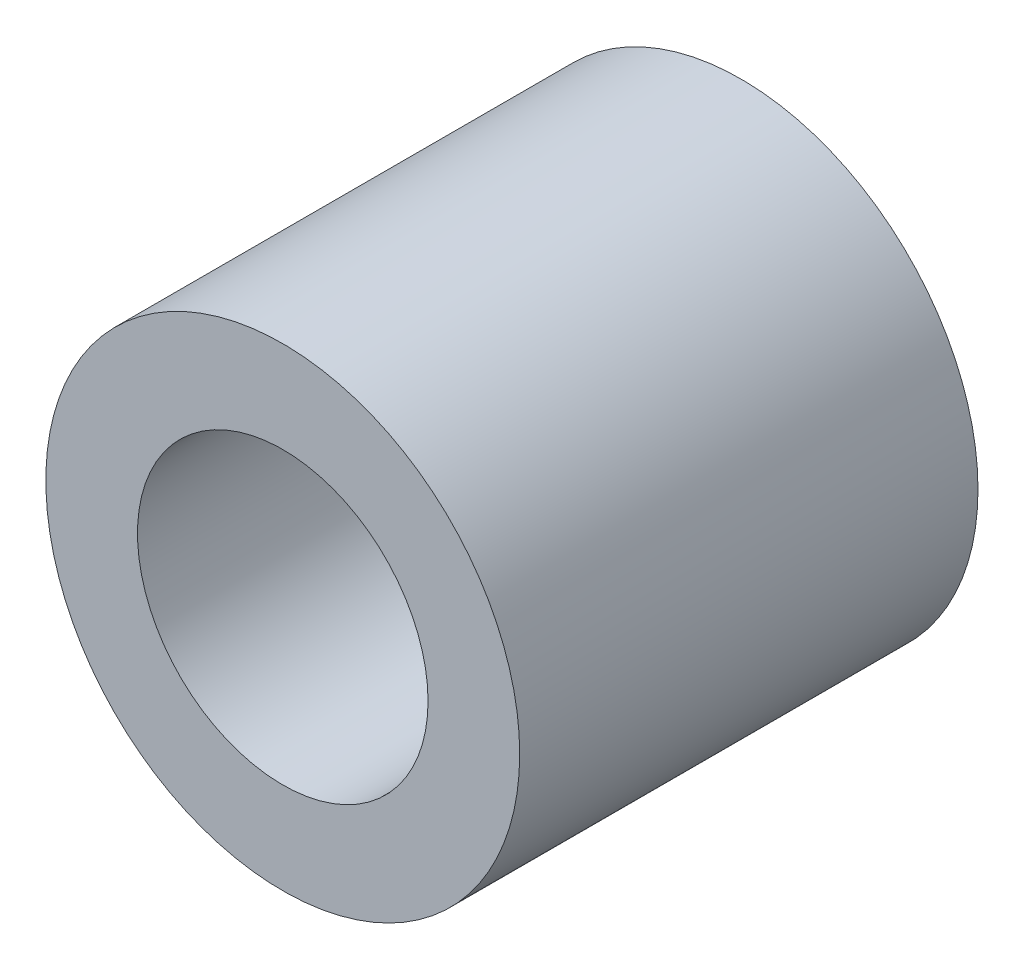
ISO-10303-21;
HEADER;
FILE_DESCRIPTION(('STEP AP214'),'2;1');
FILE_NAME('part.step','',(''),(''),'','','');
FILE_SCHEMA(('AUTOMOTIVE_DESIGN { 1 0 10303 214 1 1 1 1 }'));
ENDSEC;
DATA;
#1=APPLICATION_CONTEXT('core data for automotive mechanical design processes');
#2=APPLICATION_PROTOCOL_DEFINITION('international standard','automotive_design',2000,#1);
#3=PRODUCT_CONTEXT('',#1,'mechanical');
#4=PRODUCT('Part','Part','',(#3));
#5=PRODUCT_RELATED_PRODUCT_CATEGORY('part','',(#4));
#6=PRODUCT_DEFINITION_FORMATION('','',#4);
#7=PRODUCT_DEFINITION_CONTEXT('part definition',#1,'design');
#8=PRODUCT_DEFINITION('design','',#6,#7);
#9=PRODUCT_DEFINITION_SHAPE('','',#8);
#10=(LENGTH_UNIT() NAMED_UNIT(*) SI_UNIT(.MILLI.,.METRE.));
#11=(NAMED_UNIT(*) PLANE_ANGLE_UNIT() SI_UNIT($,.RADIAN.));
#12=(NAMED_UNIT(*) SI_UNIT($,.STERADIAN.) SOLID_ANGLE_UNIT());
#13=UNCERTAINTY_MEASURE_WITH_UNIT(LENGTH_MEASURE(1.E-05),#10,'distance_accuracy_value','');
#14=(GEOMETRIC_REPRESENTATION_CONTEXT(3) GLOBAL_UNCERTAINTY_ASSIGNED_CONTEXT((#13)) GLOBAL_UNIT_ASSIGNED_CONTEXT((#10,
#11,#12)) REPRESENTATION_CONTEXT('',''));
#15=CARTESIAN_POINT('',(0.,0.,0.));
#16=DIRECTION('',(0.,0.,1.));
#17=DIRECTION('',(1.,0.,0.));
#18=AXIS2_PLACEMENT_3D('',#15,#16,#17);
#19=CARTESIAN_POINT('',(0.,0.,5.));
#20=DIRECTION('',(0.,0.,1.));
#21=DIRECTION('',(1.,0.,0.));
#22=AXIS2_PLACEMENT_3D('',#19,#20,#21);
#23=PLANE('',#22);
#24=CARTESIAN_POINT('',(0.,0.,5.));
#25=DIRECTION('',(0.,0.,1.));
#26=DIRECTION('',(1.,0.,0.));
#27=AXIS2_PLACEMENT_3D('',#24,#25,#26);
#28=CIRCLE('',#27,2.585);
#29=CARTESIAN_POINT('',(2.585,0.,5.));
#30=VERTEX_POINT('',#29);
#31=EDGE_CURVE('E10',#30,#30,#28,.T.);
#32=ORIENTED_EDGE('',*,*,#31,.T.);
#33=EDGE_LOOP('',(#32));
#34=FACE_BOUND('',#33,.T.);
#35=CARTESIAN_POINT('',(0.,0.,5.));
#36=DIRECTION('',(0.,0.,1.));
#37=DIRECTION('',(1.,0.,0.));
#38=AXIS2_PLACEMENT_3D('',#35,#36,#37);
#39=CIRCLE('',#38,1.585);
#40=CARTESIAN_POINT('',(1.585,0.,5.));
#41=VERTEX_POINT('',#40);
#42=EDGE_CURVE('E50',#41,#41,#39,.T.);
#43=ORIENTED_EDGE('',*,*,#42,.F.);
#44=EDGE_LOOP('',(#43));
#45=FACE_BOUND('',#44,.T.);
#46=ADVANCED_FACE('F37',(#34,#45),#23,.T.);
#47=CARTESIAN_POINT('',(0.,0.,0.));
#48=DIRECTION('',(0.,0.,1.));
#49=DIRECTION('',(1.,0.,0.));
#50=AXIS2_PLACEMENT_3D('',#47,#48,#49);
#51=PLANE('',#50);
#52=CARTESIAN_POINT('',(0.,0.,0.));
#53=DIRECTION('',(0.,0.,1.));
#54=DIRECTION('',(1.,0.,0.));
#55=AXIS2_PLACEMENT_3D('',#52,#53,#54);
#56=CIRCLE('',#55,2.585);
#57=CARTESIAN_POINT('',(2.585,0.,0.));
#58=VERTEX_POINT('',#57);
#59=EDGE_CURVE('E41',#58,#58,#56,.T.);
#60=ORIENTED_EDGE('',*,*,#59,.F.);
#61=EDGE_LOOP('',(#60));
#62=FACE_BOUND('',#61,.T.);
#63=CARTESIAN_POINT('',(0.,0.,0.));
#64=DIRECTION('',(0.,0.,1.));
#65=DIRECTION('',(1.,0.,0.));
#66=AXIS2_PLACEMENT_3D('',#63,#64,#65);
#67=CIRCLE('',#66,1.585);
#68=CARTESIAN_POINT('',(1.585,0.,0.));
#69=VERTEX_POINT('',#68);
#70=EDGE_CURVE('E52',#69,#69,#67,.T.);
#71=ORIENTED_EDGE('',*,*,#70,.T.);
#72=EDGE_LOOP('',(#71));
#73=FACE_BOUND('',#72,.T.);
#74=ADVANCED_FACE('F64',(#62,#73),#51,.F.);
#75=CARTESIAN_POINT('',(0.,0.,5.));
#76=DIRECTION('',(0.,0.,-1.));
#77=DIRECTION('',(-1.,0.,0.));
#78=AXIS2_PLACEMENT_3D('',#75,#76,#77);
#79=CYLINDRICAL_SURFACE('',#78,2.585);
#80=ORIENTED_EDGE('',*,*,#31,.F.);
#81=EDGE_LOOP('',(#80));
#82=FACE_BOUND('',#81,.T.);
#83=ORIENTED_EDGE('',*,*,#59,.T.);
#84=EDGE_LOOP('',(#83));
#85=FACE_BOUND('',#84,.T.);
#86=ADVANCED_FACE('F39',(#82,#85),#79,.T.);
#87=CARTESIAN_POINT('',(0.,0.,5.));
#88=DIRECTION('',(0.,0.,-1.));
#89=DIRECTION('',(-1.,0.,0.));
#90=AXIS2_PLACEMENT_3D('',#87,#88,#89);
#91=CYLINDRICAL_SURFACE('',#90,1.585);
#92=ORIENTED_EDGE('',*,*,#42,.T.);
#93=EDGE_LOOP('',(#92));
#94=FACE_BOUND('',#93,.T.);
#95=ORIENTED_EDGE('',*,*,#70,.F.);
#96=EDGE_LOOP('',(#95));
#97=FACE_BOUND('',#96,.T.);
#98=ADVANCED_FACE('F60',(#94,#97),#91,.F.);
#99=CLOSED_SHELL('',(#46,#74,#86,#98));
#100=MANIFOLD_SOLID_BREP('B2',#99);
#101=ADVANCED_BREP_SHAPE_REPRESENTATION('',(#18,#100),#14);
#102=SHAPE_DEFINITION_REPRESENTATION(#9,#101);
ENDSEC;
END-ISO-10303-21;
